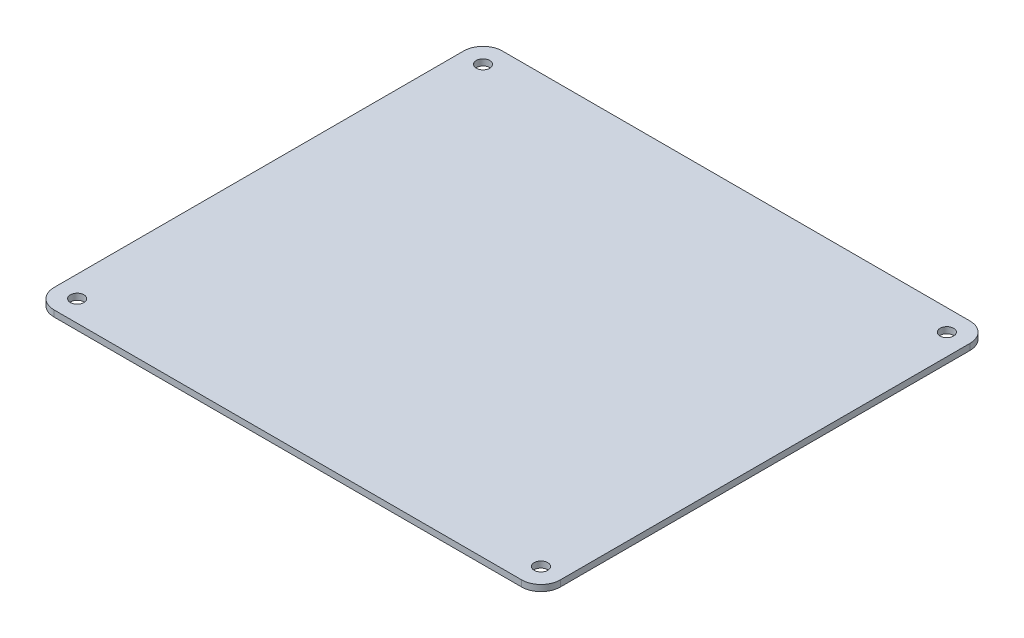
ISO-10303-21;
HEADER;
FILE_DESCRIPTION(('STEP AP214'),'2;1');
FILE_NAME('part.step','',(''),(''),'','','');
FILE_SCHEMA(('AUTOMOTIVE_DESIGN { 1 0 10303 214 1 1 1 1 }'));
ENDSEC;
DATA;
#1=APPLICATION_CONTEXT('core data for automotive mechanical design processes');
#2=APPLICATION_PROTOCOL_DEFINITION('international standard','automotive_design',2000,#1);
#3=PRODUCT_CONTEXT('',#1,'mechanical');
#4=PRODUCT('Part','Part','',(#3));
#5=PRODUCT_RELATED_PRODUCT_CATEGORY('part','',(#4));
#6=PRODUCT_DEFINITION_FORMATION('','',#4);
#7=PRODUCT_DEFINITION_CONTEXT('part definition',#1,'design');
#8=PRODUCT_DEFINITION('design','',#6,#7);
#9=PRODUCT_DEFINITION_SHAPE('','',#8);
#10=(LENGTH_UNIT() NAMED_UNIT(*) SI_UNIT(.MILLI.,.METRE.));
#11=(NAMED_UNIT(*) PLANE_ANGLE_UNIT() SI_UNIT($,.RADIAN.));
#12=(NAMED_UNIT(*) SI_UNIT($,.STERADIAN.) SOLID_ANGLE_UNIT());
#13=UNCERTAINTY_MEASURE_WITH_UNIT(LENGTH_MEASURE(1.E-05),#10,'distance_accuracy_value','');
#14=(GEOMETRIC_REPRESENTATION_CONTEXT(3) GLOBAL_UNCERTAINTY_ASSIGNED_CONTEXT((#13)) GLOBAL_UNIT_ASSIGNED_CONTEXT((#10,
#11,#12)) REPRESENTATION_CONTEXT('',''));
#15=CARTESIAN_POINT('',(0.,0.,0.));
#16=DIRECTION('',(0.,0.,1.));
#17=DIRECTION('',(1.,0.,0.));
#18=AXIS2_PLACEMENT_3D('',#15,#16,#17);
#19=CARTESIAN_POINT('',(-60.5,0.805,53.));
#20=DIRECTION('',(0.,1.,0.));
#21=DIRECTION('',(0.,0.,1.));
#22=AXIS2_PLACEMENT_3D('',#19,#20,#21);
#23=PLANE('',#22);
#24=CARTESIAN_POINT('',(60.,0.805,52.5));
#25=DIRECTION('',(0.,1.,0.));
#26=DIRECTION('',(0.,0.,1.));
#27=AXIS2_PLACEMENT_3D('',#24,#25,#26);
#28=CIRCLE('',#27,1.75);
#29=CARTESIAN_POINT('',(60.,0.805,50.75));
#30=VERTEX_POINT('',#29);
#31=EDGE_CURVE('E198',#30,#30,#28,.T.);
#32=ORIENTED_EDGE('',*,*,#31,.F.);
#33=EDGE_LOOP('',(#32));
#34=FACE_BOUND('',#33,.T.);
#35=CARTESIAN_POINT('',(-60.,0.805,-52.5));
#36=DIRECTION('',(0.,1.,0.));
#37=DIRECTION('',(0.,0.,1.));
#38=AXIS2_PLACEMENT_3D('',#35,#36,#37);
#39=CIRCLE('',#38,1.75);
#40=CARTESIAN_POINT('',(-60.,0.805,-54.25));
#41=VERTEX_POINT('',#40);
#42=EDGE_CURVE('E144',#41,#41,#39,.T.);
#43=ORIENTED_EDGE('',*,*,#42,.F.);
#44=EDGE_LOOP('',(#43));
#45=FACE_BOUND('',#44,.T.);
#46=CARTESIAN_POINT('',(-60.5,0.805,53.));
#47=DIRECTION('',(0.,1.,0.));
#48=DIRECTION('',(0.,0.,1.));
#49=AXIS2_PLACEMENT_3D('',#46,#47,#48);
#50=CIRCLE('',#49,5.);
#51=CARTESIAN_POINT('',(-65.5,0.805,53.));
#52=VERTEX_POINT('',#51);
#53=CARTESIAN_POINT('',(-60.5,0.805,58.));
#54=VERTEX_POINT('',#53);
#55=EDGE_CURVE('E155',#52,#54,#50,.T.);
#56=ORIENTED_EDGE('',*,*,#55,.T.);
#57=DIRECTION('',(1.,0.,0.));
#58=VECTOR('',#57,1.);
#59=CARTESIAN_POINT('',(-60.5,0.805,58.));
#60=LINE('',#59,#58);
#61=CARTESIAN_POINT('',(60.5,0.805,58.));
#62=VERTEX_POINT('',#61);
#63=EDGE_CURVE('E103',#54,#62,#60,.T.);
#64=ORIENTED_EDGE('',*,*,#63,.T.);
#65=CARTESIAN_POINT('',(60.5,0.805,53.));
#66=DIRECTION('',(0.,1.,0.));
#67=DIRECTION('',(0.,0.,1.));
#68=AXIS2_PLACEMENT_3D('',#65,#66,#67);
#69=CIRCLE('',#68,5.);
#70=CARTESIAN_POINT('',(65.5,0.805,53.));
#71=VERTEX_POINT('',#70);
#72=EDGE_CURVE('E170',#62,#71,#69,.T.);
#73=ORIENTED_EDGE('',*,*,#72,.T.);
#74=DIRECTION('',(0.,0.,-1.));
#75=VECTOR('',#74,1.);
#76=CARTESIAN_POINT('',(65.5,0.805,-53.));
#77=LINE('',#76,#75);
#78=CARTESIAN_POINT('',(65.5,0.805,-53.));
#79=VERTEX_POINT('',#78);
#80=EDGE_CURVE('E183',#71,#79,#77,.T.);
#81=ORIENTED_EDGE('',*,*,#80,.T.);
#82=CARTESIAN_POINT('',(60.5,0.805,-53.));
#83=DIRECTION('',(0.,1.,0.));
#84=DIRECTION('',(0.,0.,-1.));
#85=AXIS2_PLACEMENT_3D('',#82,#83,#84);
#86=CIRCLE('',#85,5.);
#87=CARTESIAN_POINT('',(60.4999999999999,0.805,-58.));
#88=VERTEX_POINT('',#87);
#89=EDGE_CURVE('E122',#79,#88,#86,.T.);
#90=ORIENTED_EDGE('',*,*,#89,.T.);
#91=DIRECTION('',(-1.,0.,0.));
#92=VECTOR('',#91,1.);
#93=CARTESIAN_POINT('',(-60.5,0.805,-58.));
#94=LINE('',#93,#92);
#95=CARTESIAN_POINT('',(-60.5,0.805,-58.));
#96=VERTEX_POINT('',#95);
#97=EDGE_CURVE('E116',#88,#96,#94,.T.);
#98=ORIENTED_EDGE('',*,*,#97,.T.);
#99=CARTESIAN_POINT('',(-60.5,0.805,-53.));
#100=DIRECTION('',(0.,1.,0.));
#101=DIRECTION('',(0.,0.,1.));
#102=AXIS2_PLACEMENT_3D('',#99,#100,#101);
#103=CIRCLE('',#102,5.);
#104=CARTESIAN_POINT('',(-65.5,0.805,-53.));
#105=VERTEX_POINT('',#104);
#106=EDGE_CURVE('E120',#96,#105,#103,.T.);
#107=ORIENTED_EDGE('',*,*,#106,.T.);
#108=DIRECTION('',(0.,0.,1.));
#109=VECTOR('',#108,1.);
#110=CARTESIAN_POINT('',(-65.5,0.805,-53.));
#111=LINE('',#110,#109);
#112=EDGE_CURVE('E60',#105,#52,#111,.T.);
#113=ORIENTED_EDGE('',*,*,#112,.T.);
#114=EDGE_LOOP('',(#56,#64,#73,#81,#90,#98,#107,#113));
#115=FACE_BOUND('',#114,.T.);
#116=CARTESIAN_POINT('',(60.,0.805,-52.5));
#117=DIRECTION('',(0.,1.,0.));
#118=DIRECTION('',(0.,0.,-1.));
#119=AXIS2_PLACEMENT_3D('',#116,#117,#118);
#120=CIRCLE('',#119,1.75);
#121=CARTESIAN_POINT('',(60.,0.805,-54.25));
#122=VERTEX_POINT('',#121);
#123=EDGE_CURVE('E192',#122,#122,#120,.T.);
#124=ORIENTED_EDGE('',*,*,#123,.F.);
#125=EDGE_LOOP('',(#124));
#126=FACE_BOUND('',#125,.T.);
#127=CARTESIAN_POINT('',(-60.,0.805,52.5));
#128=DIRECTION('',(0.,1.,0.));
#129=DIRECTION('',(0.,0.,-1.));
#130=AXIS2_PLACEMENT_3D('',#127,#128,#129);
#131=CIRCLE('',#130,1.75);
#132=CARTESIAN_POINT('',(-60.,0.805,50.75));
#133=VERTEX_POINT('',#132);
#134=EDGE_CURVE('E204',#133,#133,#131,.T.);
#135=ORIENTED_EDGE('',*,*,#134,.F.);
#136=EDGE_LOOP('',(#135));
#137=FACE_BOUND('',#136,.T.);
#138=ADVANCED_FACE('F43',(#34,#45,#115,#126,#137),#23,.T.);
#139=CARTESIAN_POINT('',(-60.5,-0.805,53.));
#140=DIRECTION('',(0.,1.,0.));
#141=DIRECTION('',(0.,0.,1.));
#142=AXIS2_PLACEMENT_3D('',#139,#140,#141);
#143=PLANE('',#142);
#144=CARTESIAN_POINT('',(-60.5,-0.805,53.));
#145=DIRECTION('',(0.,1.,0.));
#146=DIRECTION('',(0.,0.,1.));
#147=AXIS2_PLACEMENT_3D('',#144,#145,#146);
#148=CIRCLE('',#147,5.);
#149=CARTESIAN_POINT('',(-65.5,-0.805,53.));
#150=VERTEX_POINT('',#149);
#151=CARTESIAN_POINT('',(-60.5,-0.805,58.));
#152=VERTEX_POINT('',#151);
#153=EDGE_CURVE('E140',#150,#152,#148,.T.);
#154=ORIENTED_EDGE('',*,*,#153,.F.);
#155=DIRECTION('',(0.,0.,1.));
#156=VECTOR('',#155,1.);
#157=CARTESIAN_POINT('',(-65.5,-0.805,-53.));
#158=LINE('',#157,#156);
#159=CARTESIAN_POINT('',(-65.5,-0.805,-53.));
#160=VERTEX_POINT('',#159);
#161=EDGE_CURVE('E95',#160,#150,#158,.T.);
#162=ORIENTED_EDGE('',*,*,#161,.F.);
#163=CARTESIAN_POINT('',(-60.5,-0.805,-53.));
#164=DIRECTION('',(0.,1.,0.));
#165=DIRECTION('',(0.,0.,1.));
#166=AXIS2_PLACEMENT_3D('',#163,#164,#165);
#167=CIRCLE('',#166,5.);
#168=CARTESIAN_POINT('',(-60.5,-0.805,-58.));
#169=VERTEX_POINT('',#168);
#170=EDGE_CURVE('E89',#169,#160,#167,.T.);
#171=ORIENTED_EDGE('',*,*,#170,.F.);
#172=DIRECTION('',(-1.,0.,0.));
#173=VECTOR('',#172,1.);
#174=CARTESIAN_POINT('',(-60.5,-0.805,-58.));
#175=LINE('',#174,#173);
#176=CARTESIAN_POINT('',(60.4999999999999,-0.805,-58.));
#177=VERTEX_POINT('',#176);
#178=EDGE_CURVE('E130',#177,#169,#175,.T.);
#179=ORIENTED_EDGE('',*,*,#178,.F.);
#180=CARTESIAN_POINT('',(60.5,-0.805,-53.));
#181=DIRECTION('',(0.,1.,0.));
#182=DIRECTION('',(0.,0.,-1.));
#183=AXIS2_PLACEMENT_3D('',#180,#181,#182);
#184=CIRCLE('',#183,5.);
#185=CARTESIAN_POINT('',(65.5,-0.805,-53.));
#186=VERTEX_POINT('',#185);
#187=EDGE_CURVE('E150',#186,#177,#184,.T.);
#188=ORIENTED_EDGE('',*,*,#187,.F.);
#189=DIRECTION('',(0.,0.,-1.));
#190=VECTOR('',#189,1.);
#191=CARTESIAN_POINT('',(65.5,-0.805,-53.));
#192=LINE('',#191,#190);
#193=CARTESIAN_POINT('',(65.5,-0.805,53.));
#194=VERTEX_POINT('',#193);
#195=EDGE_CURVE('E148',#194,#186,#192,.T.);
#196=ORIENTED_EDGE('',*,*,#195,.F.);
#197=CARTESIAN_POINT('',(60.5,-0.805,53.));
#198=DIRECTION('',(0.,1.,0.));
#199=DIRECTION('',(0.,0.,1.));
#200=AXIS2_PLACEMENT_3D('',#197,#198,#199);
#201=CIRCLE('',#200,5.);
#202=CARTESIAN_POINT('',(60.5,-0.805,58.));
#203=VERTEX_POINT('',#202);
#204=EDGE_CURVE('E146',#203,#194,#201,.T.);
#205=ORIENTED_EDGE('',*,*,#204,.F.);
#206=DIRECTION('',(1.,0.,0.));
#207=VECTOR('',#206,1.);
#208=CARTESIAN_POINT('',(-60.5,-0.805,58.));
#209=LINE('',#208,#207);
#210=EDGE_CURVE('E143',#152,#203,#209,.T.);
#211=ORIENTED_EDGE('',*,*,#210,.F.);
#212=EDGE_LOOP('',(#154,#162,#171,#179,#188,#196,#205,#211));
#213=FACE_BOUND('',#212,.T.);
#214=CARTESIAN_POINT('',(-60.,-0.805,-52.5));
#215=DIRECTION('',(0.,1.,0.));
#216=DIRECTION('',(0.,0.,1.));
#217=AXIS2_PLACEMENT_3D('',#214,#215,#216);
#218=CIRCLE('',#217,1.75);
#219=CARTESIAN_POINT('',(-60.,-0.805,-54.25));
#220=VERTEX_POINT('',#219);
#221=EDGE_CURVE('E189',#220,#220,#218,.T.);
#222=ORIENTED_EDGE('',*,*,#221,.T.);
#223=EDGE_LOOP('',(#222));
#224=FACE_BOUND('',#223,.T.);
#225=CARTESIAN_POINT('',(60.,-0.805,-52.5));
#226=DIRECTION('',(0.,1.,0.));
#227=DIRECTION('',(0.,0.,-1.));
#228=AXIS2_PLACEMENT_3D('',#225,#226,#227);
#229=CIRCLE('',#228,1.75);
#230=CARTESIAN_POINT('',(60.,-0.805,-54.25));
#231=VERTEX_POINT('',#230);
#232=EDGE_CURVE('E195',#231,#231,#229,.T.);
#233=ORIENTED_EDGE('',*,*,#232,.T.);
#234=EDGE_LOOP('',(#233));
#235=FACE_BOUND('',#234,.T.);
#236=CARTESIAN_POINT('',(60.,-0.805,52.5));
#237=DIRECTION('',(0.,1.,0.));
#238=DIRECTION('',(0.,0.,1.));
#239=AXIS2_PLACEMENT_3D('',#236,#237,#238);
#240=CIRCLE('',#239,1.75);
#241=CARTESIAN_POINT('',(60.,-0.805,50.75));
#242=VERTEX_POINT('',#241);
#243=EDGE_CURVE('E201',#242,#242,#240,.T.);
#244=ORIENTED_EDGE('',*,*,#243,.T.);
#245=EDGE_LOOP('',(#244));
#246=FACE_BOUND('',#245,.T.);
#247=CARTESIAN_POINT('',(-60.,-0.805,52.5));
#248=DIRECTION('',(0.,1.,0.));
#249=DIRECTION('',(0.,0.,-1.));
#250=AXIS2_PLACEMENT_3D('',#247,#248,#249);
#251=CIRCLE('',#250,1.75);
#252=CARTESIAN_POINT('',(-60.,-0.805,50.75));
#253=VERTEX_POINT('',#252);
#254=EDGE_CURVE('E207',#253,#253,#251,.T.);
#255=ORIENTED_EDGE('',*,*,#254,.T.);
#256=EDGE_LOOP('',(#255));
#257=FACE_BOUND('',#256,.T.);
#258=ADVANCED_FACE('F174',(#213,#224,#235,#246,#257),#143,.F.);
#259=CARTESIAN_POINT('',(-60.5,0.805,53.));
#260=DIRECTION('',(0.,-1.,0.));
#261=DIRECTION('',(0.,0.,-1.));
#262=AXIS2_PLACEMENT_3D('',#259,#260,#261);
#263=CYLINDRICAL_SURFACE('',#262,5.);
#264=ORIENTED_EDGE('',*,*,#153,.T.);
#265=DIRECTION('',(0.,-1.,0.));
#266=VECTOR('',#265,1.);
#267=CARTESIAN_POINT('',(-60.5,0.805,58.));
#268=LINE('',#267,#266);
#269=EDGE_CURVE('E11',#54,#152,#268,.T.);
#270=ORIENTED_EDGE('',*,*,#269,.F.);
#271=ORIENTED_EDGE('',*,*,#55,.F.);
#272=DIRECTION('',(0.,-1.,0.));
#273=VECTOR('',#272,1.);
#274=CARTESIAN_POINT('',(-65.5,0.805,53.));
#275=LINE('',#274,#273);
#276=EDGE_CURVE('E136',#52,#150,#275,.T.);
#277=ORIENTED_EDGE('',*,*,#276,.T.);
#278=EDGE_LOOP('',(#264,#270,#271,#277));
#279=FACE_BOUND('',#278,.T.);
#280=ADVANCED_FACE('F45',(#279),#263,.T.);
#281=CARTESIAN_POINT('',(-60.5,0.805,58.));
#282=DIRECTION('',(0.,0.,-1.));
#283=DIRECTION('',(-1.,0.,0.));
#284=AXIS2_PLACEMENT_3D('',#281,#282,#283);
#285=PLANE('',#284);
#286=ORIENTED_EDGE('',*,*,#210,.T.);
#287=DIRECTION('',(0.,-1.,0.));
#288=VECTOR('',#287,1.);
#289=CARTESIAN_POINT('',(60.5,0.805,58.));
#290=LINE('',#289,#288);
#291=EDGE_CURVE('E52',#62,#203,#290,.T.);
#292=ORIENTED_EDGE('',*,*,#291,.F.);
#293=ORIENTED_EDGE('',*,*,#63,.F.);
#294=ORIENTED_EDGE('',*,*,#269,.T.);
#295=EDGE_LOOP('',(#286,#292,#293,#294));
#296=FACE_BOUND('',#295,.T.);
#297=ADVANCED_FACE('F241',(#296),#285,.F.);
#298=CARTESIAN_POINT('',(60.5,0.805,53.));
#299=DIRECTION('',(0.,-1.,0.));
#300=DIRECTION('',(0.,0.,-1.));
#301=AXIS2_PLACEMENT_3D('',#298,#299,#300);
#302=CYLINDRICAL_SURFACE('',#301,5.);
#303=ORIENTED_EDGE('',*,*,#204,.T.);
#304=DIRECTION('',(0.,-1.,0.));
#305=VECTOR('',#304,1.);
#306=CARTESIAN_POINT('',(65.5,0.805,53.));
#307=LINE('',#306,#305);
#308=EDGE_CURVE('E162',#71,#194,#307,.T.);
#309=ORIENTED_EDGE('',*,*,#308,.F.);
#310=ORIENTED_EDGE('',*,*,#72,.F.);
#311=ORIENTED_EDGE('',*,*,#291,.T.);
#312=EDGE_LOOP('',(#303,#309,#310,#311));
#313=FACE_BOUND('',#312,.T.);
#314=ADVANCED_FACE('F168',(#313),#302,.T.);
#315=CARTESIAN_POINT('',(65.5,0.805,-53.));
#316=DIRECTION('',(-1.,0.,0.));
#317=DIRECTION('',(0.,0.,1.));
#318=AXIS2_PLACEMENT_3D('',#315,#316,#317);
#319=PLANE('',#318);
#320=ORIENTED_EDGE('',*,*,#195,.T.);
#321=DIRECTION('',(0.,-1.,0.));
#322=VECTOR('',#321,1.);
#323=CARTESIAN_POINT('',(65.5,0.805,-53.));
#324=LINE('',#323,#322);
#325=EDGE_CURVE('E159',#79,#186,#324,.T.);
#326=ORIENTED_EDGE('',*,*,#325,.F.);
#327=ORIENTED_EDGE('',*,*,#80,.F.);
#328=ORIENTED_EDGE('',*,*,#308,.T.);
#329=EDGE_LOOP('',(#320,#326,#327,#328));
#330=FACE_BOUND('',#329,.T.);
#331=ADVANCED_FACE('F179',(#330),#319,.F.);
#332=CARTESIAN_POINT('',(60.5,0.805,-53.));
#333=DIRECTION('',(0.,-1.,0.));
#334=DIRECTION('',(0.,0.,-1.));
#335=AXIS2_PLACEMENT_3D('',#332,#333,#334);
#336=CYLINDRICAL_SURFACE('',#335,5.);
#337=ORIENTED_EDGE('',*,*,#187,.T.);
#338=DIRECTION('',(0.,-1.,0.));
#339=VECTOR('',#338,1.);
#340=CARTESIAN_POINT('',(60.4999999999999,0.805,-58.));
#341=LINE('',#340,#339);
#342=EDGE_CURVE('E131',#88,#177,#341,.T.);
#343=ORIENTED_EDGE('',*,*,#342,.F.);
#344=ORIENTED_EDGE('',*,*,#89,.F.);
#345=ORIENTED_EDGE('',*,*,#325,.T.);
#346=EDGE_LOOP('',(#337,#343,#344,#345));
#347=FACE_BOUND('',#346,.T.);
#348=ADVANCED_FACE('F182',(#347),#336,.T.);
#349=CARTESIAN_POINT('',(-60.5,0.805,-58.));
#350=DIRECTION('',(0.,0.,1.));
#351=DIRECTION('',(1.,0.,0.));
#352=AXIS2_PLACEMENT_3D('',#349,#350,#351);
#353=PLANE('',#352);
#354=ORIENTED_EDGE('',*,*,#178,.T.);
#355=DIRECTION('',(0.,-1.,0.));
#356=VECTOR('',#355,1.);
#357=CARTESIAN_POINT('',(-60.5,0.805,-58.));
#358=LINE('',#357,#356);
#359=EDGE_CURVE('E127',#96,#169,#358,.T.);
#360=ORIENTED_EDGE('',*,*,#359,.F.);
#361=ORIENTED_EDGE('',*,*,#97,.F.);
#362=ORIENTED_EDGE('',*,*,#342,.T.);
#363=EDGE_LOOP('',(#354,#360,#361,#362));
#364=FACE_BOUND('',#363,.T.);
#365=ADVANCED_FACE('F128',(#364),#353,.F.);
#366=CARTESIAN_POINT('',(-60.5,0.805,-53.));
#367=DIRECTION('',(0.,-1.,0.));
#368=DIRECTION('',(0.,0.,-1.));
#369=AXIS2_PLACEMENT_3D('',#366,#367,#368);
#370=CYLINDRICAL_SURFACE('',#369,5.);
#371=ORIENTED_EDGE('',*,*,#170,.T.);
#372=DIRECTION('',(0.,-1.,0.));
#373=VECTOR('',#372,1.);
#374=CARTESIAN_POINT('',(-65.5,0.805,-53.));
#375=LINE('',#374,#373);
#376=EDGE_CURVE('E132',#105,#160,#375,.T.);
#377=ORIENTED_EDGE('',*,*,#376,.F.);
#378=ORIENTED_EDGE('',*,*,#106,.F.);
#379=ORIENTED_EDGE('',*,*,#359,.T.);
#380=EDGE_LOOP('',(#371,#377,#378,#379));
#381=FACE_BOUND('',#380,.T.);
#382=ADVANCED_FACE('F134',(#381),#370,.T.);
#383=CARTESIAN_POINT('',(-65.5,0.805,-53.));
#384=DIRECTION('',(1.,0.,0.));
#385=DIRECTION('',(0.,0.,-1.));
#386=AXIS2_PLACEMENT_3D('',#383,#384,#385);
#387=PLANE('',#386);
#388=ORIENTED_EDGE('',*,*,#161,.T.);
#389=ORIENTED_EDGE('',*,*,#276,.F.);
#390=ORIENTED_EDGE('',*,*,#112,.F.);
#391=ORIENTED_EDGE('',*,*,#376,.T.);
#392=EDGE_LOOP('',(#388,#389,#390,#391));
#393=FACE_BOUND('',#392,.T.);
#394=ADVANCED_FACE('F229',(#393),#387,.F.);
#395=CARTESIAN_POINT('',(-60.,0.805,-52.5));
#396=DIRECTION('',(0.,-1.,0.));
#397=DIRECTION('',(0.,0.,-1.));
#398=AXIS2_PLACEMENT_3D('',#395,#396,#397);
#399=CYLINDRICAL_SURFACE('',#398,1.75);
#400=CARTESIAN_POINT('',(-60.,0.805,-54.25));
#401=CARTESIAN_POINT('',(-60.,0.788229166666667,-54.25));
#402=CARTESIAN_POINT('',(-60.,0.771458333333333,-54.25));
#403=CARTESIAN_POINT('',(-60.,0.737916666666667,-54.25));
#404=CARTESIAN_POINT('',(-60.,0.721145833333333,-54.25));
#405=CARTESIAN_POINT('',(-60.,0.687604166666667,-54.25));
#406=CARTESIAN_POINT('',(-60.,0.670833333333333,-54.25));
#407=CARTESIAN_POINT('',(-60.,0.637291666666667,-54.25));
#408=CARTESIAN_POINT('',(-60.,0.620520833333333,-54.25));
#409=CARTESIAN_POINT('',(-60.,0.586979166666667,-54.25));
#410=CARTESIAN_POINT('',(-60.,0.570208333333333,-54.25));
#411=CARTESIAN_POINT('',(-60.,0.536666666666667,-54.25));
#412=CARTESIAN_POINT('',(-60.,0.519895833333333,-54.25));
#413=CARTESIAN_POINT('',(-60.,0.486354166666667,-54.25));
#414=CARTESIAN_POINT('',(-60.,0.469583333333333,-54.25));
#415=CARTESIAN_POINT('',(-60.,0.436041666666667,-54.25));
#416=CARTESIAN_POINT('',(-60.,0.419270833333333,-54.25));
#417=CARTESIAN_POINT('',(-60.,0.385729166666667,-54.25));
#418=CARTESIAN_POINT('',(-60.,0.368958333333333,-54.25));
#419=CARTESIAN_POINT('',(-60.,0.335416666666667,-54.25));
#420=CARTESIAN_POINT('',(-60.,0.318645833333333,-54.25));
#421=CARTESIAN_POINT('',(-60.,0.285104166666667,-54.25));
#422=CARTESIAN_POINT('',(-60.,0.268333333333333,-54.25));
#423=CARTESIAN_POINT('',(-60.,0.234791666666667,-54.25));
#424=CARTESIAN_POINT('',(-60.,0.218020833333333,-54.25));
#425=CARTESIAN_POINT('',(-60.,0.184479166666667,-54.25));
#426=CARTESIAN_POINT('',(-60.,0.167708333333333,-54.25));
#427=CARTESIAN_POINT('',(-60.,0.134166666666667,-54.25));
#428=CARTESIAN_POINT('',(-60.,0.117395833333333,-54.25));
#429=CARTESIAN_POINT('',(-60.,0.0838541666666666,-54.25));
#430=CARTESIAN_POINT('',(-60.,0.0670833333333332,-54.25));
#431=CARTESIAN_POINT('',(-60.,0.0335416666666666,-54.25));
#432=CARTESIAN_POINT('',(-60.,0.0167708333333332,-54.25));
#433=CARTESIAN_POINT('',(-60.,-0.0167708333333334,-54.25));
#434=CARTESIAN_POINT('',(-60.,-0.0335416666666668,-54.25));
#435=CARTESIAN_POINT('',(-60.,-0.0670833333333335,-54.25));
#436=CARTESIAN_POINT('',(-60.,-0.0838541666666668,-54.25));
#437=CARTESIAN_POINT('',(-60.,-0.117395833333333,-54.25));
#438=CARTESIAN_POINT('',(-60.,-0.134166666666667,-54.25));
#439=CARTESIAN_POINT('',(-60.,-0.167708333333333,-54.25));
#440=CARTESIAN_POINT('',(-60.,-0.184479166666667,-54.25));
#441=CARTESIAN_POINT('',(-60.,-0.218020833333333,-54.25));
#442=CARTESIAN_POINT('',(-60.,-0.234791666666667,-54.25));
#443=CARTESIAN_POINT('',(-60.,-0.268333333333333,-54.25));
#444=CARTESIAN_POINT('',(-60.,-0.285104166666667,-54.25));
#445=CARTESIAN_POINT('',(-60.,-0.318645833333333,-54.25));
#446=CARTESIAN_POINT('',(-60.,-0.335416666666667,-54.25));
#447=CARTESIAN_POINT('',(-60.,-0.368958333333333,-54.25));
#448=CARTESIAN_POINT('',(-60.,-0.385729166666667,-54.25));
#449=CARTESIAN_POINT('',(-60.,-0.419270833333333,-54.25));
#450=CARTESIAN_POINT('',(-60.,-0.436041666666667,-54.25));
#451=CARTESIAN_POINT('',(-60.,-0.469583333333333,-54.25));
#452=CARTESIAN_POINT('',(-60.,-0.486354166666667,-54.25));
#453=CARTESIAN_POINT('',(-60.,-0.519895833333333,-54.25));
#454=CARTESIAN_POINT('',(-60.,-0.536666666666667,-54.25));
#455=CARTESIAN_POINT('',(-60.,-0.570208333333333,-54.25));
#456=CARTESIAN_POINT('',(-60.,-0.586979166666667,-54.25));
#457=CARTESIAN_POINT('',(-60.,-0.620520833333333,-54.25));
#458=CARTESIAN_POINT('',(-60.,-0.637291666666667,-54.25));
#459=CARTESIAN_POINT('',(-60.,-0.670833333333333,-54.25));
#460=CARTESIAN_POINT('',(-60.,-0.687604166666667,-54.25));
#461=CARTESIAN_POINT('',(-60.,-0.721145833333333,-54.25));
#462=CARTESIAN_POINT('',(-60.,-0.737916666666667,-54.25));
#463=CARTESIAN_POINT('',(-60.,-0.771458333333333,-54.25));
#464=CARTESIAN_POINT('',(-60.,-0.788229166666667,-54.25));
#465=CARTESIAN_POINT('',(-60.,-0.805,-54.25));
#466=B_SPLINE_CURVE_WITH_KNOTS('',3,(#400,#401,#402,#403,#404,#405,#406,#407,#408,#409,#410,
#411,#412,#413,#414,#415,#416,#417,#418,#419,#420,#421,#422,#423,#424,#425,#426,#427,#428,#429,
#430,#431,#432,#433,#434,#435,#436,#437,#438,#439,#440,#441,#442,#443,#444,#445,#446,#447,#448,
#449,#450,#451,#452,#453,#454,#455,#456,#457,#458,#459,#460,#461,#462,#463,#464,#465),
.UNSPECIFIED.,.F.,.F.,(4,2,2,2,2,2,2,2,2,2,2,2,2,2,2,2,2,2,2,2,2,2,2,2,2,2,2,2,2,2,2,2,4),(0.,
0.0503124999999999,0.100625,0.1509375,0.20125,0.2515625,0.301875,0.3521875,0.4025,0.4528125,
0.503125,0.5534375,0.60375,0.6540625,0.704375,0.7546875,0.805,0.8553125,0.905625,0.9559375,
1.00625,1.0565625,1.106875,1.1571875,1.2075,1.2578125,1.308125,1.3584375,1.40875,1.4590625,
1.509375,1.5596875,1.61),.UNSPECIFIED.);
#467=EDGE_CURVE('BSEAM226',#41,#220,#466,.T.);
#468=ORIENTED_EDGE('',*,*,#42,.T.);
#469=ORIENTED_EDGE('',*,*,#221,.F.);
#470=ORIENTED_EDGE('',*,*,#467,.T.);
#471=ORIENTED_EDGE('',*,*,#467,.F.);
#472=EDGE_LOOP('',(#468,#470,#469,#471));
#473=FACE_BOUND('',#472,.T.);
#474=ADVANCED_FACE('F226',(#473),#399,.F.);
#475=CARTESIAN_POINT('',(60.,0.805,-52.5));
#476=DIRECTION('',(0.,-1.,0.));
#477=DIRECTION('',(0.,0.,-1.));
#478=AXIS2_PLACEMENT_3D('',#475,#476,#477);
#479=CYLINDRICAL_SURFACE('',#478,1.75);
#480=CARTESIAN_POINT('',(60.,0.805,-54.25));
#481=CARTESIAN_POINT('',(60.,0.788229166666667,-54.25));
#482=CARTESIAN_POINT('',(60.,0.771458333333333,-54.25));
#483=CARTESIAN_POINT('',(60.,0.737916666666667,-54.25));
#484=CARTESIAN_POINT('',(60.,0.721145833333333,-54.25));
#485=CARTESIAN_POINT('',(60.,0.687604166666667,-54.25));
#486=CARTESIAN_POINT('',(60.,0.670833333333333,-54.25));
#487=CARTESIAN_POINT('',(60.,0.637291666666667,-54.25));
#488=CARTESIAN_POINT('',(60.,0.620520833333333,-54.25));
#489=CARTESIAN_POINT('',(60.,0.586979166666667,-54.25));
#490=CARTESIAN_POINT('',(60.,0.570208333333333,-54.25));
#491=CARTESIAN_POINT('',(60.,0.536666666666667,-54.25));
#492=CARTESIAN_POINT('',(60.,0.519895833333333,-54.25));
#493=CARTESIAN_POINT('',(60.,0.486354166666667,-54.25));
#494=CARTESIAN_POINT('',(60.,0.469583333333333,-54.25));
#495=CARTESIAN_POINT('',(60.,0.436041666666667,-54.25));
#496=CARTESIAN_POINT('',(60.,0.419270833333333,-54.25));
#497=CARTESIAN_POINT('',(60.,0.385729166666667,-54.25));
#498=CARTESIAN_POINT('',(60.,0.368958333333333,-54.25));
#499=CARTESIAN_POINT('',(60.,0.335416666666667,-54.25));
#500=CARTESIAN_POINT('',(60.,0.318645833333333,-54.25));
#501=CARTESIAN_POINT('',(60.,0.285104166666667,-54.25));
#502=CARTESIAN_POINT('',(60.,0.268333333333333,-54.25));
#503=CARTESIAN_POINT('',(60.,0.234791666666667,-54.25));
#504=CARTESIAN_POINT('',(60.,0.218020833333333,-54.25));
#505=CARTESIAN_POINT('',(60.,0.184479166666667,-54.25));
#506=CARTESIAN_POINT('',(60.,0.167708333333333,-54.25));
#507=CARTESIAN_POINT('',(60.,0.134166666666667,-54.25));
#508=CARTESIAN_POINT('',(60.,0.117395833333333,-54.25));
#509=CARTESIAN_POINT('',(60.,0.0838541666666666,-54.25));
#510=CARTESIAN_POINT('',(60.,0.0670833333333332,-54.25));
#511=CARTESIAN_POINT('',(60.,0.0335416666666666,-54.25));
#512=CARTESIAN_POINT('',(60.,0.0167708333333332,-54.25));
#513=CARTESIAN_POINT('',(60.,-0.0167708333333334,-54.25));
#514=CARTESIAN_POINT('',(60.,-0.0335416666666668,-54.25));
#515=CARTESIAN_POINT('',(60.,-0.0670833333333335,-54.25));
#516=CARTESIAN_POINT('',(60.,-0.0838541666666668,-54.25));
#517=CARTESIAN_POINT('',(60.,-0.117395833333333,-54.25));
#518=CARTESIAN_POINT('',(60.,-0.134166666666667,-54.25));
#519=CARTESIAN_POINT('',(60.,-0.167708333333333,-54.25));
#520=CARTESIAN_POINT('',(60.,-0.184479166666667,-54.25));
#521=CARTESIAN_POINT('',(60.,-0.218020833333333,-54.25));
#522=CARTESIAN_POINT('',(60.,-0.234791666666667,-54.25));
#523=CARTESIAN_POINT('',(60.,-0.268333333333333,-54.25));
#524=CARTESIAN_POINT('',(60.,-0.285104166666667,-54.25));
#525=CARTESIAN_POINT('',(60.,-0.318645833333333,-54.25));
#526=CARTESIAN_POINT('',(60.,-0.335416666666667,-54.25));
#527=CARTESIAN_POINT('',(60.,-0.368958333333333,-54.25));
#528=CARTESIAN_POINT('',(60.,-0.385729166666667,-54.25));
#529=CARTESIAN_POINT('',(60.,-0.419270833333333,-54.25));
#530=CARTESIAN_POINT('',(60.,-0.436041666666667,-54.25));
#531=CARTESIAN_POINT('',(60.,-0.469583333333333,-54.25));
#532=CARTESIAN_POINT('',(60.,-0.486354166666667,-54.25));
#533=CARTESIAN_POINT('',(60.,-0.519895833333333,-54.25));
#534=CARTESIAN_POINT('',(60.,-0.536666666666667,-54.25));
#535=CARTESIAN_POINT('',(60.,-0.570208333333333,-54.25));
#536=CARTESIAN_POINT('',(60.,-0.586979166666667,-54.25));
#537=CARTESIAN_POINT('',(60.,-0.620520833333333,-54.25));
#538=CARTESIAN_POINT('',(60.,-0.637291666666667,-54.25));
#539=CARTESIAN_POINT('',(60.,-0.670833333333333,-54.25));
#540=CARTESIAN_POINT('',(60.,-0.687604166666667,-54.25));
#541=CARTESIAN_POINT('',(60.,-0.721145833333333,-54.25));
#542=CARTESIAN_POINT('',(60.,-0.737916666666667,-54.25));
#543=CARTESIAN_POINT('',(60.,-0.771458333333333,-54.25));
#544=CARTESIAN_POINT('',(60.,-0.788229166666667,-54.25));
#545=CARTESIAN_POINT('',(60.,-0.805,-54.25));
#546=B_SPLINE_CURVE_WITH_KNOTS('',3,(#480,#481,#482,#483,#484,#485,#486,#487,#488,#489,#490,
#491,#492,#493,#494,#495,#496,#497,#498,#499,#500,#501,#502,#503,#504,#505,#506,#507,#508,#509,
#510,#511,#512,#513,#514,#515,#516,#517,#518,#519,#520,#521,#522,#523,#524,#525,#526,#527,#528,
#529,#530,#531,#532,#533,#534,#535,#536,#537,#538,#539,#540,#541,#542,#543,#544,#545),
.UNSPECIFIED.,.F.,.F.,(4,2,2,2,2,2,2,2,2,2,2,2,2,2,2,2,2,2,2,2,2,2,2,2,2,2,2,2,2,2,2,2,4),(0.,
0.0503124999999999,0.100625,0.1509375,0.20125,0.2515625,0.301875,0.3521875,0.4025,0.4528125,
0.503125,0.5534375,0.60375,0.6540625,0.704375,0.7546875,0.805,0.8553125,0.905625,0.9559375,
1.00625,1.0565625,1.106875,1.1571875,1.2075,1.2578125,1.308125,1.3584375,1.40875,1.4590625,
1.509375,1.5596875,1.61),.UNSPECIFIED.);
#547=EDGE_CURVE('BSEAM317',#122,#231,#546,.T.);
#548=ORIENTED_EDGE('',*,*,#123,.T.);
#549=ORIENTED_EDGE('',*,*,#232,.F.);
#550=ORIENTED_EDGE('',*,*,#547,.T.);
#551=ORIENTED_EDGE('',*,*,#547,.F.);
#552=EDGE_LOOP('',(#548,#550,#549,#551));
#553=FACE_BOUND('',#552,.T.);
#554=ADVANCED_FACE('F317',(#553),#479,.F.);
#555=CARTESIAN_POINT('',(60.,0.805,52.5));
#556=DIRECTION('',(0.,-1.,0.));
#557=DIRECTION('',(0.,0.,-1.));
#558=AXIS2_PLACEMENT_3D('',#555,#556,#557);
#559=CYLINDRICAL_SURFACE('',#558,1.75);
#560=CARTESIAN_POINT('',(60.,0.805,50.75));
#561=CARTESIAN_POINT('',(60.,0.788229166666667,50.75));
#562=CARTESIAN_POINT('',(60.,0.771458333333333,50.75));
#563=CARTESIAN_POINT('',(60.,0.737916666666667,50.75));
#564=CARTESIAN_POINT('',(60.,0.721145833333333,50.75));
#565=CARTESIAN_POINT('',(60.,0.687604166666667,50.75));
#566=CARTESIAN_POINT('',(60.,0.670833333333333,50.75));
#567=CARTESIAN_POINT('',(60.,0.637291666666667,50.75));
#568=CARTESIAN_POINT('',(60.,0.620520833333333,50.75));
#569=CARTESIAN_POINT('',(60.,0.586979166666667,50.75));
#570=CARTESIAN_POINT('',(60.,0.570208333333333,50.75));
#571=CARTESIAN_POINT('',(60.,0.536666666666667,50.75));
#572=CARTESIAN_POINT('',(60.,0.519895833333333,50.75));
#573=CARTESIAN_POINT('',(60.,0.486354166666667,50.75));
#574=CARTESIAN_POINT('',(60.,0.469583333333333,50.75));
#575=CARTESIAN_POINT('',(60.,0.436041666666667,50.75));
#576=CARTESIAN_POINT('',(60.,0.419270833333333,50.75));
#577=CARTESIAN_POINT('',(60.,0.385729166666667,50.75));
#578=CARTESIAN_POINT('',(60.,0.368958333333333,50.75));
#579=CARTESIAN_POINT('',(60.,0.335416666666667,50.75));
#580=CARTESIAN_POINT('',(60.,0.318645833333333,50.75));
#581=CARTESIAN_POINT('',(60.,0.285104166666667,50.75));
#582=CARTESIAN_POINT('',(60.,0.268333333333333,50.75));
#583=CARTESIAN_POINT('',(60.,0.234791666666667,50.75));
#584=CARTESIAN_POINT('',(60.,0.218020833333333,50.75));
#585=CARTESIAN_POINT('',(60.,0.184479166666667,50.75));
#586=CARTESIAN_POINT('',(60.,0.167708333333333,50.75));
#587=CARTESIAN_POINT('',(60.,0.134166666666667,50.75));
#588=CARTESIAN_POINT('',(60.,0.117395833333333,50.75));
#589=CARTESIAN_POINT('',(60.,0.0838541666666666,50.75));
#590=CARTESIAN_POINT('',(60.,0.0670833333333332,50.75));
#591=CARTESIAN_POINT('',(60.,0.0335416666666666,50.75));
#592=CARTESIAN_POINT('',(60.,0.0167708333333332,50.75));
#593=CARTESIAN_POINT('',(60.,-0.0167708333333334,50.75));
#594=CARTESIAN_POINT('',(60.,-0.0335416666666668,50.75));
#595=CARTESIAN_POINT('',(60.,-0.0670833333333335,50.75));
#596=CARTESIAN_POINT('',(60.,-0.0838541666666668,50.75));
#597=CARTESIAN_POINT('',(60.,-0.117395833333333,50.75));
#598=CARTESIAN_POINT('',(60.,-0.134166666666667,50.75));
#599=CARTESIAN_POINT('',(60.,-0.167708333333333,50.75));
#600=CARTESIAN_POINT('',(60.,-0.184479166666667,50.75));
#601=CARTESIAN_POINT('',(60.,-0.218020833333333,50.75));
#602=CARTESIAN_POINT('',(60.,-0.234791666666667,50.75));
#603=CARTESIAN_POINT('',(60.,-0.268333333333333,50.75));
#604=CARTESIAN_POINT('',(60.,-0.285104166666667,50.75));
#605=CARTESIAN_POINT('',(60.,-0.318645833333333,50.75));
#606=CARTESIAN_POINT('',(60.,-0.335416666666667,50.75));
#607=CARTESIAN_POINT('',(60.,-0.368958333333333,50.75));
#608=CARTESIAN_POINT('',(60.,-0.385729166666667,50.75));
#609=CARTESIAN_POINT('',(60.,-0.419270833333333,50.75));
#610=CARTESIAN_POINT('',(60.,-0.436041666666667,50.75));
#611=CARTESIAN_POINT('',(60.,-0.469583333333333,50.75));
#612=CARTESIAN_POINT('',(60.,-0.486354166666667,50.75));
#613=CARTESIAN_POINT('',(60.,-0.519895833333333,50.75));
#614=CARTESIAN_POINT('',(60.,-0.536666666666667,50.75));
#615=CARTESIAN_POINT('',(60.,-0.570208333333333,50.75));
#616=CARTESIAN_POINT('',(60.,-0.586979166666667,50.75));
#617=CARTESIAN_POINT('',(60.,-0.620520833333333,50.75));
#618=CARTESIAN_POINT('',(60.,-0.637291666666667,50.75));
#619=CARTESIAN_POINT('',(60.,-0.670833333333333,50.75));
#620=CARTESIAN_POINT('',(60.,-0.687604166666667,50.75));
#621=CARTESIAN_POINT('',(60.,-0.721145833333333,50.75));
#622=CARTESIAN_POINT('',(60.,-0.737916666666667,50.75));
#623=CARTESIAN_POINT('',(60.,-0.771458333333333,50.75));
#624=CARTESIAN_POINT('',(60.,-0.788229166666667,50.75));
#625=CARTESIAN_POINT('',(60.,-0.805,50.75));
#626=B_SPLINE_CURVE_WITH_KNOTS('',3,(#560,#561,#562,#563,#564,#565,#566,#567,#568,#569,#570,
#571,#572,#573,#574,#575,#576,#577,#578,#579,#580,#581,#582,#583,#584,#585,#586,#587,#588,#589,
#590,#591,#592,#593,#594,#595,#596,#597,#598,#599,#600,#601,#602,#603,#604,#605,#606,#607,#608,
#609,#610,#611,#612,#613,#614,#615,#616,#617,#618,#619,#620,#621,#622,#623,#624,#625),
.UNSPECIFIED.,.F.,.F.,(4,2,2,2,2,2,2,2,2,2,2,2,2,2,2,2,2,2,2,2,2,2,2,2,2,2,2,2,2,2,2,2,4),(0.,
0.0503124999999999,0.100625,0.1509375,0.20125,0.2515625,0.301875,0.3521875,0.4025,0.4528125,
0.503125,0.5534375,0.60375,0.6540625,0.704375,0.7546875,0.805,0.8553125,0.905625,0.9559375,
1.00625,1.0565625,1.106875,1.1571875,1.2075,1.2578125,1.308125,1.3584375,1.40875,1.4590625,
1.509375,1.5596875,1.61),.UNSPECIFIED.);
#627=EDGE_CURVE('BSEAM326',#30,#242,#626,.T.);
#628=ORIENTED_EDGE('',*,*,#31,.T.);
#629=ORIENTED_EDGE('',*,*,#243,.F.);
#630=ORIENTED_EDGE('',*,*,#627,.T.);
#631=ORIENTED_EDGE('',*,*,#627,.F.);
#632=EDGE_LOOP('',(#628,#630,#629,#631));
#633=FACE_BOUND('',#632,.T.);
#634=ADVANCED_FACE('F326',(#633),#559,.F.);
#635=CARTESIAN_POINT('',(-60.,0.805,52.5));
#636=DIRECTION('',(0.,-1.,0.));
#637=DIRECTION('',(0.,0.,-1.));
#638=AXIS2_PLACEMENT_3D('',#635,#636,#637);
#639=CYLINDRICAL_SURFACE('',#638,1.75);
#640=CARTESIAN_POINT('',(-60.,0.805,50.75));
#641=CARTESIAN_POINT('',(-60.,0.788229166666667,50.75));
#642=CARTESIAN_POINT('',(-60.,0.771458333333333,50.75));
#643=CARTESIAN_POINT('',(-60.,0.737916666666667,50.75));
#644=CARTESIAN_POINT('',(-60.,0.721145833333333,50.75));
#645=CARTESIAN_POINT('',(-60.,0.687604166666667,50.75));
#646=CARTESIAN_POINT('',(-60.,0.670833333333333,50.75));
#647=CARTESIAN_POINT('',(-60.,0.637291666666667,50.75));
#648=CARTESIAN_POINT('',(-60.,0.620520833333333,50.75));
#649=CARTESIAN_POINT('',(-60.,0.586979166666667,50.75));
#650=CARTESIAN_POINT('',(-60.,0.570208333333333,50.75));
#651=CARTESIAN_POINT('',(-60.,0.536666666666667,50.75));
#652=CARTESIAN_POINT('',(-60.,0.519895833333333,50.75));
#653=CARTESIAN_POINT('',(-60.,0.486354166666667,50.75));
#654=CARTESIAN_POINT('',(-60.,0.469583333333333,50.75));
#655=CARTESIAN_POINT('',(-60.,0.436041666666667,50.75));
#656=CARTESIAN_POINT('',(-60.,0.419270833333333,50.75));
#657=CARTESIAN_POINT('',(-60.,0.385729166666667,50.75));
#658=CARTESIAN_POINT('',(-60.,0.368958333333333,50.75));
#659=CARTESIAN_POINT('',(-60.,0.335416666666667,50.75));
#660=CARTESIAN_POINT('',(-60.,0.318645833333333,50.75));
#661=CARTESIAN_POINT('',(-60.,0.285104166666667,50.75));
#662=CARTESIAN_POINT('',(-60.,0.268333333333333,50.75));
#663=CARTESIAN_POINT('',(-60.,0.234791666666667,50.75));
#664=CARTESIAN_POINT('',(-60.,0.218020833333333,50.75));
#665=CARTESIAN_POINT('',(-60.,0.184479166666667,50.75));
#666=CARTESIAN_POINT('',(-60.,0.167708333333333,50.75));
#667=CARTESIAN_POINT('',(-60.,0.134166666666667,50.75));
#668=CARTESIAN_POINT('',(-60.,0.117395833333333,50.75));
#669=CARTESIAN_POINT('',(-60.,0.0838541666666666,50.75));
#670=CARTESIAN_POINT('',(-60.,0.0670833333333332,50.75));
#671=CARTESIAN_POINT('',(-60.,0.0335416666666666,50.75));
#672=CARTESIAN_POINT('',(-60.,0.0167708333333332,50.75));
#673=CARTESIAN_POINT('',(-60.,-0.0167708333333334,50.75));
#674=CARTESIAN_POINT('',(-60.,-0.0335416666666668,50.75));
#675=CARTESIAN_POINT('',(-60.,-0.0670833333333335,50.75));
#676=CARTESIAN_POINT('',(-60.,-0.0838541666666668,50.75));
#677=CARTESIAN_POINT('',(-60.,-0.117395833333333,50.75));
#678=CARTESIAN_POINT('',(-60.,-0.134166666666667,50.75));
#679=CARTESIAN_POINT('',(-60.,-0.167708333333333,50.75));
#680=CARTESIAN_POINT('',(-60.,-0.184479166666667,50.75));
#681=CARTESIAN_POINT('',(-60.,-0.218020833333333,50.75));
#682=CARTESIAN_POINT('',(-60.,-0.234791666666667,50.75));
#683=CARTESIAN_POINT('',(-60.,-0.268333333333333,50.75));
#684=CARTESIAN_POINT('',(-60.,-0.285104166666667,50.75));
#685=CARTESIAN_POINT('',(-60.,-0.318645833333333,50.75));
#686=CARTESIAN_POINT('',(-60.,-0.335416666666667,50.75));
#687=CARTESIAN_POINT('',(-60.,-0.368958333333333,50.75));
#688=CARTESIAN_POINT('',(-60.,-0.385729166666667,50.75));
#689=CARTESIAN_POINT('',(-60.,-0.419270833333333,50.75));
#690=CARTESIAN_POINT('',(-60.,-0.436041666666667,50.75));
#691=CARTESIAN_POINT('',(-60.,-0.469583333333333,50.75));
#692=CARTESIAN_POINT('',(-60.,-0.486354166666667,50.75));
#693=CARTESIAN_POINT('',(-60.,-0.519895833333333,50.75));
#694=CARTESIAN_POINT('',(-60.,-0.536666666666667,50.75));
#695=CARTESIAN_POINT('',(-60.,-0.570208333333333,50.75));
#696=CARTESIAN_POINT('',(-60.,-0.586979166666667,50.75));
#697=CARTESIAN_POINT('',(-60.,-0.620520833333333,50.75));
#698=CARTESIAN_POINT('',(-60.,-0.637291666666667,50.75));
#699=CARTESIAN_POINT('',(-60.,-0.670833333333333,50.75));
#700=CARTESIAN_POINT('',(-60.,-0.687604166666667,50.75));
#701=CARTESIAN_POINT('',(-60.,-0.721145833333333,50.75));
#702=CARTESIAN_POINT('',(-60.,-0.737916666666667,50.75));
#703=CARTESIAN_POINT('',(-60.,-0.771458333333333,50.75));
#704=CARTESIAN_POINT('',(-60.,-0.788229166666667,50.75));
#705=CARTESIAN_POINT('',(-60.,-0.805,50.75));
#706=B_SPLINE_CURVE_WITH_KNOTS('',3,(#640,#641,#642,#643,#644,#645,#646,#647,#648,#649,#650,
#651,#652,#653,#654,#655,#656,#657,#658,#659,#660,#661,#662,#663,#664,#665,#666,#667,#668,#669,
#670,#671,#672,#673,#674,#675,#676,#677,#678,#679,#680,#681,#682,#683,#684,#685,#686,#687,#688,
#689,#690,#691,#692,#693,#694,#695,#696,#697,#698,#699,#700,#701,#702,#703,#704,#705),
.UNSPECIFIED.,.F.,.F.,(4,2,2,2,2,2,2,2,2,2,2,2,2,2,2,2,2,2,2,2,2,2,2,2,2,2,2,2,2,2,2,2,4),(0.,
0.0503124999999999,0.100625,0.1509375,0.20125,0.2515625,0.301875,0.3521875,0.4025,0.4528125,
0.503125,0.5534375,0.60375,0.6540625,0.704375,0.7546875,0.805,0.8553125,0.905625,0.9559375,
1.00625,1.0565625,1.106875,1.1571875,1.2075,1.2578125,1.308125,1.3584375,1.40875,1.4590625,
1.509375,1.5596875,1.61),.UNSPECIFIED.);
#707=EDGE_CURVE('BSEAM213',#133,#253,#706,.T.);
#708=ORIENTED_EDGE('',*,*,#134,.T.);
#709=ORIENTED_EDGE('',*,*,#254,.F.);
#710=ORIENTED_EDGE('',*,*,#707,.T.);
#711=ORIENTED_EDGE('',*,*,#707,.F.);
#712=EDGE_LOOP('',(#708,#710,#709,#711));
#713=FACE_BOUND('',#712,.T.);
#714=ADVANCED_FACE('F213',(#713),#639,.F.);
#715=CLOSED_SHELL('',(#138,#258,#280,#297,#314,#331,#348,#365,#382,#394,#474,#554,#634,#714));
#716=MANIFOLD_SOLID_BREP('B2',#715);
#717=ADVANCED_BREP_SHAPE_REPRESENTATION('',(#18,#716),#14);
#718=SHAPE_DEFINITION_REPRESENTATION(#9,#717);
ENDSEC;
END-ISO-10303-21;
